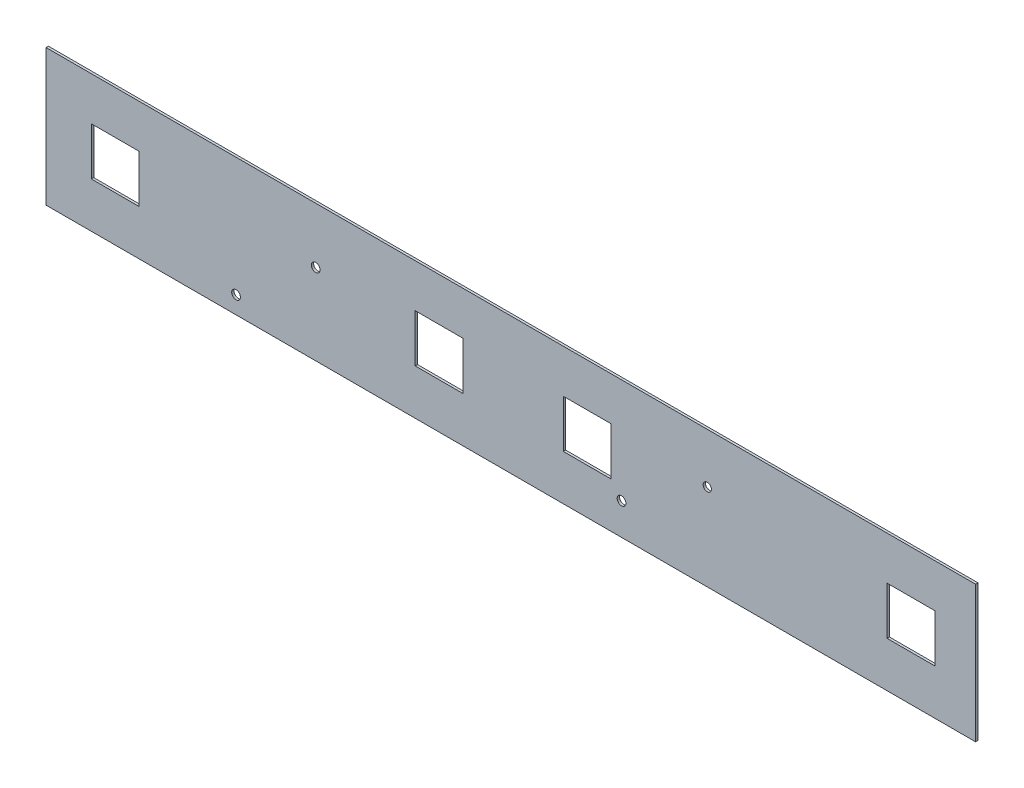
ISO-10303-21;
HEADER;
FILE_DESCRIPTION(('STEP AP214'),'2;1');
FILE_NAME('part.step','',(''),(''),'','','');
FILE_SCHEMA(('AUTOMOTIVE_DESIGN { 1 0 10303 214 1 1 1 1 }'));
ENDSEC;
DATA;
#1=APPLICATION_CONTEXT('core data for automotive mechanical design processes');
#2=APPLICATION_PROTOCOL_DEFINITION('international standard','automotive_design',2000,#1);
#3=PRODUCT_CONTEXT('',#1,'mechanical');
#4=PRODUCT('Part','Part','',(#3));
#5=PRODUCT_RELATED_PRODUCT_CATEGORY('part','',(#4));
#6=PRODUCT_DEFINITION_FORMATION('','',#4);
#7=PRODUCT_DEFINITION_CONTEXT('part definition',#1,'design');
#8=PRODUCT_DEFINITION('design','',#6,#7);
#9=PRODUCT_DEFINITION_SHAPE('','',#8);
#10=(LENGTH_UNIT() NAMED_UNIT(*) SI_UNIT(.MILLI.,.METRE.));
#11=(NAMED_UNIT(*) PLANE_ANGLE_UNIT() SI_UNIT($,.RADIAN.));
#12=(NAMED_UNIT(*) SI_UNIT($,.STERADIAN.) SOLID_ANGLE_UNIT());
#13=UNCERTAINTY_MEASURE_WITH_UNIT(LENGTH_MEASURE(1.E-05),#10,'distance_accuracy_value','');
#14=(GEOMETRIC_REPRESENTATION_CONTEXT(3) GLOBAL_UNCERTAINTY_ASSIGNED_CONTEXT((#13)) GLOBAL_UNIT_ASSIGNED_CONTEXT((#10,
#11,#12)) REPRESENTATION_CONTEXT('',''));
#15=CARTESIAN_POINT('',(0.,0.,0.));
#16=DIRECTION('',(0.,0.,1.));
#17=DIRECTION('',(1.,0.,0.));
#18=AXIS2_PLACEMENT_3D('',#15,#16,#17);
#19=CARTESIAN_POINT('',(-350.636981865229,-168.419363817683,-1.5875));
#20=DIRECTION('',(-1.,0.,0.));
#21=DIRECTION('',(0.,0.,1.));
#22=AXIS2_PLACEMENT_3D('',#19,#20,#21);
#23=PLANE('',#22);
#24=DIRECTION('',(0.,-1.,0.));
#25=VECTOR('',#24,1.);
#26=CARTESIAN_POINT('',(-350.636981865229,-168.419363817683,0.));
#27=LINE('',#26,#25);
#28=CARTESIAN_POINT('',(-350.636981865229,-76.8447438176829,0.));
#29=VERTEX_POINT('',#28);
#30=CARTESIAN_POINT('',(-350.636981865229,-168.419363817683,0.));
#31=VERTEX_POINT('',#30);
#32=EDGE_CURVE('E349',#29,#31,#27,.T.);
#33=ORIENTED_EDGE('',*,*,#32,.F.);
#34=DIRECTION('',(0.,0.,1.));
#35=VECTOR('',#34,1.);
#36=CARTESIAN_POINT('',(-350.636981865229,-76.8447438176829,-1.5875));
#37=LINE('',#36,#35);
#38=CARTESIAN_POINT('',(-350.636981865229,-76.8447438176829,-1.5875));
#39=VERTEX_POINT('',#38);
#40=EDGE_CURVE('E193',#39,#29,#37,.T.);
#41=ORIENTED_EDGE('',*,*,#40,.F.);
#42=DIRECTION('',(0.,-1.,0.));
#43=VECTOR('',#42,1.);
#44=CARTESIAN_POINT('',(-350.636981865229,-168.419363817683,-1.5875));
#45=LINE('',#44,#43);
#46=CARTESIAN_POINT('',(-350.636981865229,-168.419363817683,-1.5875));
#47=VERTEX_POINT('',#46);
#48=EDGE_CURVE('E197',#39,#47,#45,.T.);
#49=ORIENTED_EDGE('',*,*,#48,.T.);
#50=DIRECTION('',(0.,0.,1.));
#51=VECTOR('',#50,1.);
#52=CARTESIAN_POINT('',(-350.636981865229,-168.419363817683,-1.5875));
#53=LINE('',#52,#51);
#54=EDGE_CURVE('E42',#47,#31,#53,.T.);
#55=ORIENTED_EDGE('',*,*,#54,.T.);
#56=EDGE_LOOP('',(#33,#41,#49,#55));
#57=FACE_BOUND('',#56,.T.);
#58=ADVANCED_FACE('F39',(#57),#23,.T.);
#59=CARTESIAN_POINT('',(272.922858134777,-168.419363817683,-1.5875));
#60=DIRECTION('',(1.,0.,0.));
#61=DIRECTION('',(0.,0.,-1.));
#62=AXIS2_PLACEMENT_3D('',#59,#60,#61);
#63=PLANE('',#62);
#64=DIRECTION('',(0.,1.,0.));
#65=VECTOR('',#64,1.);
#66=CARTESIAN_POINT('',(272.922858134777,-168.419363817683,0.));
#67=LINE('',#66,#65);
#68=CARTESIAN_POINT('',(272.922858134777,-168.419363817683,0.));
#69=VERTEX_POINT('',#68);
#70=CARTESIAN_POINT('',(272.922858134777,-76.8447438176829,0.));
#71=VERTEX_POINT('',#70);
#72=EDGE_CURVE('E353',#69,#71,#67,.T.);
#73=ORIENTED_EDGE('',*,*,#72,.F.);
#74=DIRECTION('',(0.,0.,1.));
#75=VECTOR('',#74,1.);
#76=CARTESIAN_POINT('',(272.922858134777,-168.419363817683,-1.5875));
#77=LINE('',#76,#75);
#78=CARTESIAN_POINT('',(272.922858134777,-168.419363817683,-1.5875));
#79=VERTEX_POINT('',#78);
#80=EDGE_CURVE('E11',#79,#69,#77,.T.);
#81=ORIENTED_EDGE('',*,*,#80,.F.);
#82=DIRECTION('',(0.,1.,0.));
#83=VECTOR('',#82,1.);
#84=CARTESIAN_POINT('',(272.922858134777,-168.419363817683,-1.5875));
#85=LINE('',#84,#83);
#86=CARTESIAN_POINT('',(272.922858134777,-76.8447438176829,-1.5875));
#87=VERTEX_POINT('',#86);
#88=EDGE_CURVE('E174',#79,#87,#85,.T.);
#89=ORIENTED_EDGE('',*,*,#88,.T.);
#90=DIRECTION('',(0.,0.,1.));
#91=VECTOR('',#90,1.);
#92=CARTESIAN_POINT('',(272.922858134777,-76.8447438176829,-1.5875));
#93=LINE('',#92,#91);
#94=EDGE_CURVE('E178',#87,#71,#93,.T.);
#95=ORIENTED_EDGE('',*,*,#94,.T.);
#96=EDGE_LOOP('',(#73,#81,#89,#95));
#97=FACE_BOUND('',#96,.T.);
#98=ADVANCED_FACE('F177',(#97),#63,.T.);
#99=CARTESIAN_POINT('',(-350.636981865229,-168.419363817683,-1.5875));
#100=DIRECTION('',(0.,-1.,0.));
#101=DIRECTION('',(0.,0.,-1.));
#102=AXIS2_PLACEMENT_3D('',#99,#100,#101);
#103=PLANE('',#102);
#104=DIRECTION('',(1.,0.,0.));
#105=VECTOR('',#104,1.);
#106=CARTESIAN_POINT('',(-350.636981865229,-168.419363817683,0.));
#107=LINE('',#106,#105);
#108=EDGE_CURVE('E357',#31,#69,#107,.T.);
#109=ORIENTED_EDGE('',*,*,#108,.F.);
#110=ORIENTED_EDGE('',*,*,#54,.F.);
#111=DIRECTION('',(1.,0.,0.));
#112=VECTOR('',#111,1.);
#113=CARTESIAN_POINT('',(-350.636981865229,-168.419363817683,-1.5875));
#114=LINE('',#113,#112);
#115=EDGE_CURVE('E184',#47,#79,#114,.T.);
#116=ORIENTED_EDGE('',*,*,#115,.T.);
#117=ORIENTED_EDGE('',*,*,#80,.T.);
#118=EDGE_LOOP('',(#109,#110,#116,#117));
#119=FACE_BOUND('',#118,.T.);
#120=ADVANCED_FACE('F364',(#119),#103,.T.);
#121=CARTESIAN_POINT('',(0.,0.,-1.5875));
#122=DIRECTION('',(0.,0.,-1.));
#123=DIRECTION('',(-1.,0.,0.));
#124=AXIS2_PLACEMENT_3D('',#121,#122,#123);
#125=PLANE('',#124);
#126=CARTESIAN_POINT('',(35.3919470457483,-147.147547141894,-1.5875));
#127=DIRECTION('',(0.,0.,1.));
#128=DIRECTION('',(1.,0.,0.));
#129=AXIS2_PLACEMENT_3D('',#126,#127,#128);
#130=CIRCLE('',#129,2.921);
#131=CARTESIAN_POINT('',(38.3129470457483,-147.147547141894,-1.5875));
#132=VERTEX_POINT('',#131);
#133=EDGE_CURVE('E298',#132,#132,#130,.T.);
#134=ORIENTED_EDGE('',*,*,#133,.T.);
#135=EDGE_LOOP('',(#134));
#136=FACE_BOUND('',#135,.T.);
#137=CARTESIAN_POINT('',(-169.771284735148,-114.16527071053,-1.5875));
#138=DIRECTION('',(0.,0.,1.));
#139=DIRECTION('',(1.,0.,0.));
#140=AXIS2_PLACEMENT_3D('',#137,#138,#139);
#141=CIRCLE('',#140,2.92100000000005);
#142=CARTESIAN_POINT('',(-166.850284735148,-114.16527071053,-1.5875));
#143=VERTEX_POINT('',#142);
#144=EDGE_CURVE('E305',#143,#143,#141,.T.);
#145=ORIENTED_EDGE('',*,*,#144,.T.);
#146=EDGE_LOOP('',(#145));
#147=FACE_BOUND('',#146,.T.);
#148=CARTESIAN_POINT('',(-223.149152531126,-156.736460083098,-1.5875));
#149=DIRECTION('',(0.,0.,1.));
#150=DIRECTION('',(1.,0.,0.));
#151=AXIS2_PLACEMENT_3D('',#148,#149,#150);
#152=CIRCLE('',#151,2.921);
#153=CARTESIAN_POINT('',(-220.228152531126,-156.736460083098,-1.5875));
#154=VERTEX_POINT('',#153);
#155=EDGE_CURVE('E311',#154,#154,#152,.T.);
#156=ORIENTED_EDGE('',*,*,#155,.T.);
#157=EDGE_LOOP('',(#156));
#158=FACE_BOUND('',#157,.T.);
#159=DIRECTION('',(0.,-1.,0.));
#160=VECTOR('',#159,1.);
#161=CARTESIAN_POINT('',(-320.189901865221,-137.992427931692,-1.5875));
#162=LINE('',#161,#160);
#163=CARTESIAN_POINT('',(-320.189901865221,-105.912427931693,-1.5875));
#164=VERTEX_POINT('',#163);
#165=CARTESIAN_POINT('',(-320.189901865221,-137.992427931692,-1.5875));
#166=VERTEX_POINT('',#165);
#167=EDGE_CURVE('E318',#164,#166,#162,.T.);
#168=ORIENTED_EDGE('',*,*,#167,.T.);
#169=DIRECTION('',(1.,0.,0.));
#170=VECTOR('',#169,1.);
#171=CARTESIAN_POINT('',(-320.189901865221,-137.992427931692,-1.5875));
#172=LINE('',#171,#170);
#173=CARTESIAN_POINT('',(-288.109901865222,-137.992427931692,-1.5875));
#174=VERTEX_POINT('',#173);
#175=EDGE_CURVE('E321',#166,#174,#172,.T.);
#176=ORIENTED_EDGE('',*,*,#175,.T.);
#177=DIRECTION('',(0.,1.,0.));
#178=VECTOR('',#177,1.);
#179=CARTESIAN_POINT('',(-288.109901865222,-137.992427931692,-1.5875));
#180=LINE('',#179,#178);
#181=CARTESIAN_POINT('',(-288.109901865222,-105.912427931693,-1.5875));
#182=VERTEX_POINT('',#181);
#183=EDGE_CURVE('E53',#174,#182,#180,.T.);
#184=ORIENTED_EDGE('',*,*,#183,.T.);
#185=DIRECTION('',(-1.,0.,0.));
#186=VECTOR('',#185,1.);
#187=CARTESIAN_POINT('',(-320.189901865221,-105.912427931693,-1.5875));
#188=LINE('',#187,#186);
#189=EDGE_CURVE('E326',#182,#164,#188,.T.);
#190=ORIENTED_EDGE('',*,*,#189,.T.);
#191=EDGE_LOOP('',(#168,#176,#184,#190));
#192=FACE_BOUND('',#191,.T.);
#193=DIRECTION('',(0.,-1.,0.));
#194=VECTOR('',#193,1.);
#195=CARTESIAN_POINT('',(-102.971641865221,-137.99242793169,-1.5875));
#196=LINE('',#195,#194);
#197=CARTESIAN_POINT('',(-102.971641865221,-105.912427931692,-1.5875));
#198=VERTEX_POINT('',#197);
#199=CARTESIAN_POINT('',(-102.971641865221,-137.99242793169,-1.5875));
#200=VERTEX_POINT('',#199);
#201=EDGE_CURVE('E204',#198,#200,#196,.T.);
#202=ORIENTED_EDGE('',*,*,#201,.T.);
#203=DIRECTION('',(1.,0.,0.));
#204=VECTOR('',#203,1.);
#205=CARTESIAN_POINT('',(-102.971641865221,-137.99242793169,-1.5875));
#206=LINE('',#205,#204);
#207=CARTESIAN_POINT('',(-70.8916418652224,-137.99242793169,-1.5875));
#208=VERTEX_POINT('',#207);
#209=EDGE_CURVE('E207',#200,#208,#206,.T.);
#210=ORIENTED_EDGE('',*,*,#209,.T.);
#211=DIRECTION('',(0.,1.,0.));
#212=VECTOR('',#211,1.);
#213=CARTESIAN_POINT('',(-70.8916418652224,-137.99242793169,-1.5875));
#214=LINE('',#213,#212);
#215=CARTESIAN_POINT('',(-70.8916418652224,-105.912427931692,-1.5875));
#216=VERTEX_POINT('',#215);
#217=EDGE_CURVE('E61',#208,#216,#214,.T.);
#218=ORIENTED_EDGE('',*,*,#217,.T.);
#219=DIRECTION('',(-1.,0.,0.));
#220=VECTOR('',#219,1.);
#221=CARTESIAN_POINT('',(-102.971641865221,-105.912427931692,-1.5875));
#222=LINE('',#221,#220);
#223=EDGE_CURVE('E212',#216,#198,#222,.T.);
#224=ORIENTED_EDGE('',*,*,#223,.T.);
#225=EDGE_LOOP('',(#202,#210,#218,#224));
#226=FACE_BOUND('',#225,.T.);
#227=DIRECTION('',(0.,-1.,0.));
#228=VECTOR('',#227,1.);
#229=CARTESIAN_POINT('',(-3.64748186522514,-137.99242793169,-1.5875));
#230=LINE('',#229,#228);
#231=CARTESIAN_POINT('',(-3.64748186522514,-105.912427931693,-1.5875));
#232=VERTEX_POINT('',#231);
#233=CARTESIAN_POINT('',(-3.64748186522514,-137.99242793169,-1.5875));
#234=VERTEX_POINT('',#233);
#235=EDGE_CURVE('E236',#232,#234,#230,.T.);
#236=ORIENTED_EDGE('',*,*,#235,.T.);
#237=DIRECTION('',(1.,0.,0.));
#238=VECTOR('',#237,1.);
#239=CARTESIAN_POINT('',(-3.64748186522514,-137.99242793169,-1.5875));
#240=LINE('',#239,#238);
#241=CARTESIAN_POINT('',(28.4325181347717,-137.99242793169,-1.5875));
#242=VERTEX_POINT('',#241);
#243=EDGE_CURVE('E239',#234,#242,#240,.T.);
#244=ORIENTED_EDGE('',*,*,#243,.T.);
#245=DIRECTION('',(0.,1.,0.));
#246=VECTOR('',#245,1.);
#247=CARTESIAN_POINT('',(28.4325181347717,-137.99242793169,-1.5875));
#248=LINE('',#247,#246);
#249=CARTESIAN_POINT('',(28.4325181347717,-105.912427931693,-1.5875));
#250=VERTEX_POINT('',#249);
#251=EDGE_CURVE('E243',#242,#250,#248,.T.);
#252=ORIENTED_EDGE('',*,*,#251,.T.);
#253=DIRECTION('',(-1.,0.,0.));
#254=VECTOR('',#253,1.);
#255=CARTESIAN_POINT('',(-3.64748186522514,-105.912427931693,-1.5875));
#256=LINE('',#255,#254);
#257=EDGE_CURVE('E246',#250,#232,#256,.T.);
#258=ORIENTED_EDGE('',*,*,#257,.T.);
#259=EDGE_LOOP('',(#236,#244,#252,#258));
#260=FACE_BOUND('',#259,.T.);
#261=DIRECTION('',(0.,-1.,0.));
#262=VECTOR('',#261,1.);
#263=CARTESIAN_POINT('',(213.570778134775,-137.992427931688,-1.5875));
#264=LINE('',#263,#262);
#265=CARTESIAN_POINT('',(213.570778134775,-105.912427931693,-1.5875));
#266=VERTEX_POINT('',#265);
#267=CARTESIAN_POINT('',(213.570778134775,-137.992427931688,-1.5875));
#268=VERTEX_POINT('',#267);
#269=EDGE_CURVE('E268',#266,#268,#264,.T.);
#270=ORIENTED_EDGE('',*,*,#269,.T.);
#271=DIRECTION('',(1.,0.,0.));
#272=VECTOR('',#271,1.);
#273=CARTESIAN_POINT('',(213.570778134775,-137.992427931688,-1.5875));
#274=LINE('',#273,#272);
#275=CARTESIAN_POINT('',(245.65077813477,-137.992427931688,-1.5875));
#276=VERTEX_POINT('',#275);
#277=EDGE_CURVE('E271',#268,#276,#274,.T.);
#278=ORIENTED_EDGE('',*,*,#277,.T.);
#279=DIRECTION('',(0.,1.,0.));
#280=VECTOR('',#279,1.);
#281=CARTESIAN_POINT('',(245.65077813477,-137.992427931688,-1.5875));
#282=LINE('',#281,#280);
#283=CARTESIAN_POINT('',(245.65077813477,-105.912427931693,-1.5875));
#284=VERTEX_POINT('',#283);
#285=EDGE_CURVE('E275',#276,#284,#282,.T.);
#286=ORIENTED_EDGE('',*,*,#285,.T.);
#287=DIRECTION('',(-1.,0.,0.));
#288=VECTOR('',#287,1.);
#289=CARTESIAN_POINT('',(213.570778134775,-105.912427931693,-1.5875));
#290=LINE('',#289,#288);
#291=EDGE_CURVE('E278',#284,#266,#290,.T.);
#292=ORIENTED_EDGE('',*,*,#291,.T.);
#293=EDGE_LOOP('',(#270,#278,#286,#292));
#294=FACE_BOUND('',#293,.T.);
#295=CARTESIAN_POINT('',(92.9145155292168,-110.36906090191,-1.5875));
#296=DIRECTION('',(0.,0.,1.));
#297=DIRECTION('',(1.,0.,0.));
#298=AXIS2_PLACEMENT_3D('',#295,#296,#297);
#299=CIRCLE('',#298,2.75000000000002);
#300=CARTESIAN_POINT('',(95.6645155292168,-110.36906090191,-1.5875));
#301=VERTEX_POINT('',#300);
#302=EDGE_CURVE('E346',#301,#301,#299,.T.);
#303=ORIENTED_EDGE('',*,*,#302,.T.);
#304=EDGE_LOOP('',(#303));
#305=FACE_BOUND('',#304,.T.);
#306=ORIENTED_EDGE('',*,*,#48,.F.);
#307=DIRECTION('',(-1.,0.,0.));
#308=VECTOR('',#307,1.);
#309=CARTESIAN_POINT('',(-350.636981865229,-76.8447438176829,-1.5875));
#310=LINE('',#309,#308);
#311=EDGE_CURVE('E190',#87,#39,#310,.T.);
#312=ORIENTED_EDGE('',*,*,#311,.F.);
#313=ORIENTED_EDGE('',*,*,#88,.F.);
#314=ORIENTED_EDGE('',*,*,#115,.F.);
#315=EDGE_LOOP('',(#306,#312,#313,#314));
#316=FACE_BOUND('',#315,.T.);
#317=ADVANCED_FACE('F195',(#136,#147,#158,#192,#226,#260,#294,#305,#316),#125,.T.);
#318=CARTESIAN_POINT('',(0.,0.,0.));
#319=DIRECTION('',(0.,0.,-1.));
#320=DIRECTION('',(-1.,0.,0.));
#321=AXIS2_PLACEMENT_3D('',#318,#319,#320);
#322=PLANE('',#321);
#323=CARTESIAN_POINT('',(35.3919470457483,-147.147547141894,0.));
#324=DIRECTION('',(0.,0.,1.));
#325=DIRECTION('',(1.,0.,0.));
#326=AXIS2_PLACEMENT_3D('',#323,#324,#325);
#327=CIRCLE('',#326,2.921);
#328=CARTESIAN_POINT('',(38.3129470457483,-147.147547141894,0.));
#329=VERTEX_POINT('',#328);
#330=EDGE_CURVE('E302',#329,#329,#327,.T.);
#331=ORIENTED_EDGE('',*,*,#330,.F.);
#332=EDGE_LOOP('',(#331));
#333=FACE_BOUND('',#332,.T.);
#334=CARTESIAN_POINT('',(-169.771284735148,-114.16527071053,0.));
#335=DIRECTION('',(0.,0.,1.));
#336=DIRECTION('',(1.,0.,0.));
#337=AXIS2_PLACEMENT_3D('',#334,#335,#336);
#338=CIRCLE('',#337,2.92100000000005);
#339=CARTESIAN_POINT('',(-166.850284735148,-114.16527071053,0.));
#340=VERTEX_POINT('',#339);
#341=EDGE_CURVE('E308',#340,#340,#338,.T.);
#342=ORIENTED_EDGE('',*,*,#341,.F.);
#343=EDGE_LOOP('',(#342));
#344=FACE_BOUND('',#343,.T.);
#345=CARTESIAN_POINT('',(-223.149152531126,-156.736460083098,0.));
#346=DIRECTION('',(0.,0.,1.));
#347=DIRECTION('',(1.,0.,0.));
#348=AXIS2_PLACEMENT_3D('',#345,#346,#347);
#349=CIRCLE('',#348,2.921);
#350=CARTESIAN_POINT('',(-220.228152531126,-156.736460083098,0.));
#351=VERTEX_POINT('',#350);
#352=EDGE_CURVE('E314',#351,#351,#349,.T.);
#353=ORIENTED_EDGE('',*,*,#352,.F.);
#354=EDGE_LOOP('',(#353));
#355=FACE_BOUND('',#354,.T.);
#356=DIRECTION('',(1.,0.,0.));
#357=VECTOR('',#356,1.);
#358=CARTESIAN_POINT('',(-320.189901865221,-137.992427931692,0.));
#359=LINE('',#358,#357);
#360=CARTESIAN_POINT('',(-320.189901865221,-137.992427931692,0.));
#361=VERTEX_POINT('',#360);
#362=CARTESIAN_POINT('',(-288.109901865222,-137.992427931692,0.));
#363=VERTEX_POINT('',#362);
#364=EDGE_CURVE('E331',#361,#363,#359,.T.);
#365=ORIENTED_EDGE('',*,*,#364,.F.);
#366=DIRECTION('',(0.,-1.,0.));
#367=VECTOR('',#366,1.);
#368=CARTESIAN_POINT('',(-320.189901865221,-137.992427931692,0.));
#369=LINE('',#368,#367);
#370=CARTESIAN_POINT('',(-320.189901865221,-105.912427931693,0.));
#371=VERTEX_POINT('',#370);
#372=EDGE_CURVE('E229',#371,#361,#369,.T.);
#373=ORIENTED_EDGE('',*,*,#372,.F.);
#374=DIRECTION('',(-1.,0.,0.));
#375=VECTOR('',#374,1.);
#376=CARTESIAN_POINT('',(-320.189901865221,-105.912427931693,0.));
#377=LINE('',#376,#375);
#378=CARTESIAN_POINT('',(-288.109901865222,-105.912427931693,0.));
#379=VERTEX_POINT('',#378);
#380=EDGE_CURVE('E322',#379,#371,#377,.T.);
#381=ORIENTED_EDGE('',*,*,#380,.F.);
#382=DIRECTION('',(0.,1.,0.));
#383=VECTOR('',#382,1.);
#384=CARTESIAN_POINT('',(-288.109901865222,-137.992427931692,0.));
#385=LINE('',#384,#383);
#386=EDGE_CURVE('E334',#363,#379,#385,.T.);
#387=ORIENTED_EDGE('',*,*,#386,.F.);
#388=EDGE_LOOP('',(#365,#373,#381,#387));
#389=FACE_BOUND('',#388,.T.);
#390=DIRECTION('',(1.,0.,0.));
#391=VECTOR('',#390,1.);
#392=CARTESIAN_POINT('',(-102.971641865221,-137.99242793169,0.));
#393=LINE('',#392,#391);
#394=CARTESIAN_POINT('',(-102.971641865221,-137.99242793169,0.));
#395=VERTEX_POINT('',#394);
#396=CARTESIAN_POINT('',(-70.8916418652224,-137.99242793169,0.));
#397=VERTEX_POINT('',#396);
#398=EDGE_CURVE('E218',#395,#397,#393,.T.);
#399=ORIENTED_EDGE('',*,*,#398,.F.);
#400=DIRECTION('',(0.,-1.,0.));
#401=VECTOR('',#400,1.);
#402=CARTESIAN_POINT('',(-102.971641865221,-137.99242793169,0.));
#403=LINE('',#402,#401);
#404=CARTESIAN_POINT('',(-102.971641865221,-105.912427931692,0.));
#405=VERTEX_POINT('',#404);
#406=EDGE_CURVE('E216',#405,#395,#403,.T.);
#407=ORIENTED_EDGE('',*,*,#406,.F.);
#408=DIRECTION('',(-1.,0.,0.));
#409=VECTOR('',#408,1.);
#410=CARTESIAN_POINT('',(-102.971641865221,-105.912427931692,0.));
#411=LINE('',#410,#409);
#412=CARTESIAN_POINT('',(-70.8916418652224,-105.912427931692,0.));
#413=VERTEX_POINT('',#412);
#414=EDGE_CURVE('E208',#413,#405,#411,.T.);
#415=ORIENTED_EDGE('',*,*,#414,.F.);
#416=DIRECTION('',(0.,1.,0.));
#417=VECTOR('',#416,1.);
#418=CARTESIAN_POINT('',(-70.8916418652224,-137.99242793169,0.));
#419=LINE('',#418,#417);
#420=EDGE_CURVE('E222',#397,#413,#419,.T.);
#421=ORIENTED_EDGE('',*,*,#420,.F.);
#422=EDGE_LOOP('',(#399,#407,#415,#421));
#423=FACE_BOUND('',#422,.T.);
#424=DIRECTION('',(1.,0.,0.));
#425=VECTOR('',#424,1.);
#426=CARTESIAN_POINT('',(-3.64748186522514,-137.99242793169,0.));
#427=LINE('',#426,#425);
#428=CARTESIAN_POINT('',(-3.64748186522514,-137.99242793169,0.));
#429=VERTEX_POINT('',#428);
#430=CARTESIAN_POINT('',(28.4325181347717,-137.99242793169,0.));
#431=VERTEX_POINT('',#430);
#432=EDGE_CURVE('E252',#429,#431,#427,.T.);
#433=ORIENTED_EDGE('',*,*,#432,.F.);
#434=DIRECTION('',(0.,-1.,0.));
#435=VECTOR('',#434,1.);
#436=CARTESIAN_POINT('',(-3.64748186522514,-137.99242793169,0.));
#437=LINE('',#436,#435);
#438=CARTESIAN_POINT('',(-3.64748186522514,-105.912427931693,0.));
#439=VERTEX_POINT('',#438);
#440=EDGE_CURVE('E250',#439,#429,#437,.T.);
#441=ORIENTED_EDGE('',*,*,#440,.F.);
#442=DIRECTION('',(-1.,0.,0.));
#443=VECTOR('',#442,1.);
#444=CARTESIAN_POINT('',(-3.64748186522514,-105.912427931693,0.));
#445=LINE('',#444,#443);
#446=CARTESIAN_POINT('',(28.4325181347717,-105.912427931693,0.));
#447=VERTEX_POINT('',#446);
#448=EDGE_CURVE('E240',#447,#439,#445,.T.);
#449=ORIENTED_EDGE('',*,*,#448,.F.);
#450=DIRECTION('',(0.,1.,0.));
#451=VECTOR('',#450,1.);
#452=CARTESIAN_POINT('',(28.4325181347717,-137.99242793169,0.));
#453=LINE('',#452,#451);
#454=EDGE_CURVE('E256',#431,#447,#453,.T.);
#455=ORIENTED_EDGE('',*,*,#454,.F.);
#456=EDGE_LOOP('',(#433,#441,#449,#455));
#457=FACE_BOUND('',#456,.T.);
#458=DIRECTION('',(1.,0.,0.));
#459=VECTOR('',#458,1.);
#460=CARTESIAN_POINT('',(213.570778134775,-137.992427931688,0.));
#461=LINE('',#460,#459);
#462=CARTESIAN_POINT('',(213.570778134775,-137.992427931688,0.));
#463=VERTEX_POINT('',#462);
#464=CARTESIAN_POINT('',(245.65077813477,-137.992427931688,0.));
#465=VERTEX_POINT('',#464);
#466=EDGE_CURVE('E283',#463,#465,#461,.T.);
#467=ORIENTED_EDGE('',*,*,#466,.F.);
#468=DIRECTION('',(0.,-1.,0.));
#469=VECTOR('',#468,1.);
#470=CARTESIAN_POINT('',(213.570778134775,-137.992427931688,0.));
#471=LINE('',#470,#469);
#472=CARTESIAN_POINT('',(213.570778134775,-105.912427931693,0.));
#473=VERTEX_POINT('',#472);
#474=EDGE_CURVE('E202',#473,#463,#471,.T.);
#475=ORIENTED_EDGE('',*,*,#474,.F.);
#476=DIRECTION('',(-1.,0.,0.));
#477=VECTOR('',#476,1.);
#478=CARTESIAN_POINT('',(213.570778134775,-105.912427931693,0.));
#479=LINE('',#478,#477);
#480=CARTESIAN_POINT('',(245.65077813477,-105.912427931693,0.));
#481=VERTEX_POINT('',#480);
#482=EDGE_CURVE('E272',#481,#473,#479,.T.);
#483=ORIENTED_EDGE('',*,*,#482,.F.);
#484=DIRECTION('',(0.,1.,0.));
#485=VECTOR('',#484,1.);
#486=CARTESIAN_POINT('',(245.65077813477,-137.992427931688,0.));
#487=LINE('',#486,#485);
#488=EDGE_CURVE('E286',#465,#481,#487,.T.);
#489=ORIENTED_EDGE('',*,*,#488,.F.);
#490=EDGE_LOOP('',(#467,#475,#483,#489));
#491=FACE_BOUND('',#490,.T.);
#492=CARTESIAN_POINT('',(92.9145155292168,-110.36906090191,0.));
#493=DIRECTION('',(0.,0.,1.));
#494=DIRECTION('',(1.,0.,0.));
#495=AXIS2_PLACEMENT_3D('',#492,#493,#494);
#496=CIRCLE('',#495,2.75000000000002);
#497=CARTESIAN_POINT('',(95.6645155292168,-110.36906090191,0.));
#498=VERTEX_POINT('',#497);
#499=EDGE_CURVE('E301',#498,#498,#496,.T.);
#500=ORIENTED_EDGE('',*,*,#499,.F.);
#501=EDGE_LOOP('',(#500));
#502=FACE_BOUND('',#501,.T.);
#503=ORIENTED_EDGE('',*,*,#32,.T.);
#504=ORIENTED_EDGE('',*,*,#108,.T.);
#505=ORIENTED_EDGE('',*,*,#72,.T.);
#506=DIRECTION('',(-1.,0.,0.));
#507=VECTOR('',#506,1.);
#508=CARTESIAN_POINT('',(-350.636981865229,-76.8447438176829,0.));
#509=LINE('',#508,#507);
#510=EDGE_CURVE('E192',#71,#29,#509,.T.);
#511=ORIENTED_EDGE('',*,*,#510,.T.);
#512=EDGE_LOOP('',(#503,#504,#505,#511));
#513=FACE_BOUND('',#512,.T.);
#514=ADVANCED_FACE('F361',(#333,#344,#355,#389,#423,#457,#491,#502,#513),#322,.F.);
#515=CARTESIAN_POINT('',(92.9145155292168,-110.36906090191,-1.5875));
#516=DIRECTION('',(0.,0.,1.));
#517=DIRECTION('',(1.,0.,0.));
#518=AXIS2_PLACEMENT_3D('',#515,#516,#517);
#519=CYLINDRICAL_SURFACE('',#518,2.75000000000002);
#520=ORIENTED_EDGE('',*,*,#302,.F.);
#521=EDGE_LOOP('',(#520));
#522=FACE_BOUND('',#521,.T.);
#523=ORIENTED_EDGE('',*,*,#499,.T.);
#524=EDGE_LOOP('',(#523));
#525=FACE_BOUND('',#524,.T.);
#526=ADVANCED_FACE('F377',(#522,#525),#519,.F.);
#527=CARTESIAN_POINT('',(213.570778134775,-137.992427931688,-1.5875));
#528=DIRECTION('',(-1.,0.,0.));
#529=DIRECTION('',(0.,0.,1.));
#530=AXIS2_PLACEMENT_3D('',#527,#528,#529);
#531=PLANE('',#530);
#532=ORIENTED_EDGE('',*,*,#474,.T.);
#533=DIRECTION('',(0.,0.,1.));
#534=VECTOR('',#533,1.);
#535=CARTESIAN_POINT('',(213.570778134775,-137.992427931688,-1.5875));
#536=LINE('',#535,#534);
#537=EDGE_CURVE('E281',#268,#463,#536,.T.);
#538=ORIENTED_EDGE('',*,*,#537,.F.);
#539=ORIENTED_EDGE('',*,*,#269,.F.);
#540=DIRECTION('',(0.,0.,1.));
#541=VECTOR('',#540,1.);
#542=CARTESIAN_POINT('',(213.570778134775,-105.912427931693,-1.5875));
#543=LINE('',#542,#541);
#544=EDGE_CURVE('E253',#266,#473,#543,.T.);
#545=ORIENTED_EDGE('',*,*,#544,.T.);
#546=EDGE_LOOP('',(#532,#538,#539,#545));
#547=FACE_BOUND('',#546,.T.);
#548=ADVANCED_FACE('F384',(#547),#531,.F.);
#549=CARTESIAN_POINT('',(213.570778134775,-105.912427931693,-1.5875));
#550=DIRECTION('',(0.,1.,0.));
#551=DIRECTION('',(0.,0.,1.));
#552=AXIS2_PLACEMENT_3D('',#549,#550,#551);
#553=PLANE('',#552);
#554=ORIENTED_EDGE('',*,*,#482,.T.);
#555=ORIENTED_EDGE('',*,*,#544,.F.);
#556=ORIENTED_EDGE('',*,*,#291,.F.);
#557=DIRECTION('',(0.,0.,1.));
#558=VECTOR('',#557,1.);
#559=CARTESIAN_POINT('',(245.65077813477,-105.912427931693,-1.5875));
#560=LINE('',#559,#558);
#561=EDGE_CURVE('E292',#284,#481,#560,.T.);
#562=ORIENTED_EDGE('',*,*,#561,.T.);
#563=EDGE_LOOP('',(#554,#555,#556,#562));
#564=FACE_BOUND('',#563,.T.);
#565=ADVANCED_FACE('F416',(#564),#553,.F.);
#566=CARTESIAN_POINT('',(245.65077813477,-137.992427931688,-1.5875));
#567=DIRECTION('',(1.,0.,0.));
#568=DIRECTION('',(0.,0.,-1.));
#569=AXIS2_PLACEMENT_3D('',#566,#567,#568);
#570=PLANE('',#569);
#571=ORIENTED_EDGE('',*,*,#488,.T.);
#572=ORIENTED_EDGE('',*,*,#561,.F.);
#573=ORIENTED_EDGE('',*,*,#285,.F.);
#574=DIRECTION('',(0.,0.,1.));
#575=VECTOR('',#574,1.);
#576=CARTESIAN_POINT('',(245.65077813477,-137.992427931688,-1.5875));
#577=LINE('',#576,#575);
#578=EDGE_CURVE('E294',#276,#465,#577,.T.);
#579=ORIENTED_EDGE('',*,*,#578,.T.);
#580=EDGE_LOOP('',(#571,#572,#573,#579));
#581=FACE_BOUND('',#580,.T.);
#582=ADVANCED_FACE('F422',(#581),#570,.F.);
#583=CARTESIAN_POINT('',(213.570778134775,-137.992427931688,-1.5875));
#584=DIRECTION('',(0.,-1.,0.));
#585=DIRECTION('',(0.,0.,-1.));
#586=AXIS2_PLACEMENT_3D('',#583,#584,#585);
#587=PLANE('',#586);
#588=ORIENTED_EDGE('',*,*,#466,.T.);
#589=ORIENTED_EDGE('',*,*,#578,.F.);
#590=ORIENTED_EDGE('',*,*,#277,.F.);
#591=ORIENTED_EDGE('',*,*,#537,.T.);
#592=EDGE_LOOP('',(#588,#589,#590,#591));
#593=FACE_BOUND('',#592,.T.);
#594=ADVANCED_FACE('F418',(#593),#587,.F.);
#595=CARTESIAN_POINT('',(-3.64748186522514,-137.99242793169,-1.5875));
#596=DIRECTION('',(-1.,0.,0.));
#597=DIRECTION('',(0.,0.,1.));
#598=AXIS2_PLACEMENT_3D('',#595,#596,#597);
#599=PLANE('',#598);
#600=ORIENTED_EDGE('',*,*,#440,.T.);
#601=DIRECTION('',(0.,0.,1.));
#602=VECTOR('',#601,1.);
#603=CARTESIAN_POINT('',(-3.64748186522514,-137.99242793169,-1.5875));
#604=LINE('',#603,#602);
#605=EDGE_CURVE('E249',#234,#429,#604,.T.);
#606=ORIENTED_EDGE('',*,*,#605,.F.);
#607=ORIENTED_EDGE('',*,*,#235,.F.);
#608=DIRECTION('',(0.,0.,1.));
#609=VECTOR('',#608,1.);
#610=CARTESIAN_POINT('',(-3.64748186522514,-105.912427931693,-1.5875));
#611=LINE('',#610,#609);
#612=EDGE_CURVE('E219',#232,#439,#611,.T.);
#613=ORIENTED_EDGE('',*,*,#612,.T.);
#614=EDGE_LOOP('',(#600,#606,#607,#613));
#615=FACE_BOUND('',#614,.T.);
#616=ADVANCED_FACE('F421',(#615),#599,.F.);
#617=CARTESIAN_POINT('',(-3.64748186522514,-105.912427931693,-1.5875));
#618=DIRECTION('',(0.,1.,0.));
#619=DIRECTION('',(0.,0.,1.));
#620=AXIS2_PLACEMENT_3D('',#617,#618,#619);
#621=PLANE('',#620);
#622=ORIENTED_EDGE('',*,*,#448,.T.);
#623=ORIENTED_EDGE('',*,*,#612,.F.);
#624=ORIENTED_EDGE('',*,*,#257,.F.);
#625=DIRECTION('',(0.,0.,1.));
#626=VECTOR('',#625,1.);
#627=CARTESIAN_POINT('',(28.4325181347717,-105.912427931693,-1.5875));
#628=LINE('',#627,#626);
#629=EDGE_CURVE('E262',#250,#447,#628,.T.);
#630=ORIENTED_EDGE('',*,*,#629,.T.);
#631=EDGE_LOOP('',(#622,#623,#624,#630));
#632=FACE_BOUND('',#631,.T.);
#633=ADVANCED_FACE('F432',(#632),#621,.F.);
#634=CARTESIAN_POINT('',(28.4325181347717,-137.99242793169,-1.5875));
#635=DIRECTION('',(1.,0.,0.));
#636=DIRECTION('',(0.,0.,-1.));
#637=AXIS2_PLACEMENT_3D('',#634,#635,#636);
#638=PLANE('',#637);
#639=ORIENTED_EDGE('',*,*,#454,.T.);
#640=ORIENTED_EDGE('',*,*,#629,.F.);
#641=ORIENTED_EDGE('',*,*,#251,.F.);
#642=DIRECTION('',(0.,0.,1.));
#643=VECTOR('',#642,1.);
#644=CARTESIAN_POINT('',(28.4325181347717,-137.99242793169,-1.5875));
#645=LINE('',#644,#643);
#646=EDGE_CURVE('E264',#242,#431,#645,.T.);
#647=ORIENTED_EDGE('',*,*,#646,.T.);
#648=EDGE_LOOP('',(#639,#640,#641,#647));
#649=FACE_BOUND('',#648,.T.);
#650=ADVANCED_FACE('F438',(#649),#638,.F.);
#651=CARTESIAN_POINT('',(-3.64748186522514,-137.99242793169,-1.5875));
#652=DIRECTION('',(0.,-1.,0.));
#653=DIRECTION('',(0.,0.,-1.));
#654=AXIS2_PLACEMENT_3D('',#651,#652,#653);
#655=PLANE('',#654);
#656=ORIENTED_EDGE('',*,*,#432,.T.);
#657=ORIENTED_EDGE('',*,*,#646,.F.);
#658=ORIENTED_EDGE('',*,*,#243,.F.);
#659=ORIENTED_EDGE('',*,*,#605,.T.);
#660=EDGE_LOOP('',(#656,#657,#658,#659));
#661=FACE_BOUND('',#660,.T.);
#662=ADVANCED_FACE('F434',(#661),#655,.F.);
#663=CARTESIAN_POINT('',(-102.971641865221,-137.99242793169,-1.5875));
#664=DIRECTION('',(-1.,0.,0.));
#665=DIRECTION('',(0.,0.,1.));
#666=AXIS2_PLACEMENT_3D('',#663,#664,#665);
#667=PLANE('',#666);
#668=ORIENTED_EDGE('',*,*,#406,.T.);
#669=DIRECTION('',(0.,0.,1.));
#670=VECTOR('',#669,1.);
#671=CARTESIAN_POINT('',(-102.971641865221,-137.99242793169,-1.5875));
#672=LINE('',#671,#670);
#673=EDGE_CURVE('E215',#200,#395,#672,.T.);
#674=ORIENTED_EDGE('',*,*,#673,.F.);
#675=ORIENTED_EDGE('',*,*,#201,.F.);
#676=DIRECTION('',(0.,0.,1.));
#677=VECTOR('',#676,1.);
#678=CARTESIAN_POINT('',(-102.971641865221,-105.912427931692,-1.5875));
#679=LINE('',#678,#677);
#680=EDGE_CURVE('E227',#198,#405,#679,.T.);
#681=ORIENTED_EDGE('',*,*,#680,.T.);
#682=EDGE_LOOP('',(#668,#674,#675,#681));
#683=FACE_BOUND('',#682,.T.);
#684=ADVANCED_FACE('F437',(#683),#667,.F.);
#685=CARTESIAN_POINT('',(-102.971641865221,-105.912427931692,-1.5875));
#686=DIRECTION('',(0.,1.,0.));
#687=DIRECTION('',(0.,0.,1.));
#688=AXIS2_PLACEMENT_3D('',#685,#686,#687);
#689=PLANE('',#688);
#690=ORIENTED_EDGE('',*,*,#414,.T.);
#691=ORIENTED_EDGE('',*,*,#680,.F.);
#692=ORIENTED_EDGE('',*,*,#223,.F.);
#693=DIRECTION('',(0.,0.,1.));
#694=VECTOR('',#693,1.);
#695=CARTESIAN_POINT('',(-70.8916418652224,-105.912427931692,-1.5875));
#696=LINE('',#695,#694);
#697=EDGE_CURVE('E230',#216,#413,#696,.T.);
#698=ORIENTED_EDGE('',*,*,#697,.T.);
#699=EDGE_LOOP('',(#690,#691,#692,#698));
#700=FACE_BOUND('',#699,.T.);
#701=ADVANCED_FACE('F448',(#700),#689,.F.);
#702=CARTESIAN_POINT('',(-70.8916418652224,-137.99242793169,-1.5875));
#703=DIRECTION('',(1.,0.,0.));
#704=DIRECTION('',(0.,0.,-1.));
#705=AXIS2_PLACEMENT_3D('',#702,#703,#704);
#706=PLANE('',#705);
#707=ORIENTED_EDGE('',*,*,#420,.T.);
#708=ORIENTED_EDGE('',*,*,#697,.F.);
#709=ORIENTED_EDGE('',*,*,#217,.F.);
#710=DIRECTION('',(0.,0.,1.));
#711=VECTOR('',#710,1.);
#712=CARTESIAN_POINT('',(-70.8916418652224,-137.99242793169,-1.5875));
#713=LINE('',#712,#711);
#714=EDGE_CURVE('E232',#208,#397,#713,.T.);
#715=ORIENTED_EDGE('',*,*,#714,.T.);
#716=EDGE_LOOP('',(#707,#708,#709,#715));
#717=FACE_BOUND('',#716,.T.);
#718=ADVANCED_FACE('F452',(#717),#706,.F.);
#719=CARTESIAN_POINT('',(-102.971641865221,-137.99242793169,-1.5875));
#720=DIRECTION('',(0.,-1.,0.));
#721=DIRECTION('',(0.,0.,-1.));
#722=AXIS2_PLACEMENT_3D('',#719,#720,#721);
#723=PLANE('',#722);
#724=ORIENTED_EDGE('',*,*,#398,.T.);
#725=ORIENTED_EDGE('',*,*,#714,.F.);
#726=ORIENTED_EDGE('',*,*,#209,.F.);
#727=ORIENTED_EDGE('',*,*,#673,.T.);
#728=EDGE_LOOP('',(#724,#725,#726,#727));
#729=FACE_BOUND('',#728,.T.);
#730=ADVANCED_FACE('F390',(#729),#723,.F.);
#731=CARTESIAN_POINT('',(-320.189901865221,-137.992427931692,-1.5875));
#732=DIRECTION('',(-1.,0.,0.));
#733=DIRECTION('',(0.,0.,1.));
#734=AXIS2_PLACEMENT_3D('',#731,#732,#733);
#735=PLANE('',#734);
#736=ORIENTED_EDGE('',*,*,#372,.T.);
#737=DIRECTION('',(0.,0.,1.));
#738=VECTOR('',#737,1.);
#739=CARTESIAN_POINT('',(-320.189901865221,-137.992427931692,-1.5875));
#740=LINE('',#739,#738);
#741=EDGE_CURVE('E329',#166,#361,#740,.T.);
#742=ORIENTED_EDGE('',*,*,#741,.F.);
#743=ORIENTED_EDGE('',*,*,#167,.F.);
#744=DIRECTION('',(0.,0.,1.));
#745=VECTOR('',#744,1.);
#746=CARTESIAN_POINT('',(-320.189901865221,-105.912427931693,-1.5875));
#747=LINE('',#746,#745);
#748=EDGE_CURVE('E317',#164,#371,#747,.T.);
#749=ORIENTED_EDGE('',*,*,#748,.T.);
#750=EDGE_LOOP('',(#736,#742,#743,#749));
#751=FACE_BOUND('',#750,.T.);
#752=ADVANCED_FACE('F386',(#751),#735,.F.);
#753=CARTESIAN_POINT('',(-320.189901865221,-105.912427931693,-1.5875));
#754=DIRECTION('',(0.,1.,0.));
#755=DIRECTION('',(0.,0.,1.));
#756=AXIS2_PLACEMENT_3D('',#753,#754,#755);
#757=PLANE('',#756);
#758=ORIENTED_EDGE('',*,*,#380,.T.);
#759=ORIENTED_EDGE('',*,*,#748,.F.);
#760=ORIENTED_EDGE('',*,*,#189,.F.);
#761=DIRECTION('',(0.,0.,1.));
#762=VECTOR('',#761,1.);
#763=CARTESIAN_POINT('',(-288.109901865222,-105.912427931693,-1.5875));
#764=LINE('',#763,#762);
#765=EDGE_CURVE('E340',#182,#379,#764,.T.);
#766=ORIENTED_EDGE('',*,*,#765,.T.);
#767=EDGE_LOOP('',(#758,#759,#760,#766));
#768=FACE_BOUND('',#767,.T.);
#769=ADVANCED_FACE('F389',(#768),#757,.F.);
#770=CARTESIAN_POINT('',(-288.109901865222,-137.992427931692,-1.5875));
#771=DIRECTION('',(1.,0.,0.));
#772=DIRECTION('',(0.,0.,-1.));
#773=AXIS2_PLACEMENT_3D('',#770,#771,#772);
#774=PLANE('',#773);
#775=ORIENTED_EDGE('',*,*,#386,.T.);
#776=ORIENTED_EDGE('',*,*,#765,.F.);
#777=ORIENTED_EDGE('',*,*,#183,.F.);
#778=DIRECTION('',(0.,0.,1.));
#779=VECTOR('',#778,1.);
#780=CARTESIAN_POINT('',(-288.109901865222,-137.992427931692,-1.5875));
#781=LINE('',#780,#779);
#782=EDGE_CURVE('E342',#174,#363,#781,.T.);
#783=ORIENTED_EDGE('',*,*,#782,.T.);
#784=EDGE_LOOP('',(#775,#776,#777,#783));
#785=FACE_BOUND('',#784,.T.);
#786=ADVANCED_FACE('F396',(#785),#774,.F.);
#787=CARTESIAN_POINT('',(-320.189901865221,-137.992427931692,-1.5875));
#788=DIRECTION('',(0.,-1.,0.));
#789=DIRECTION('',(0.,0.,-1.));
#790=AXIS2_PLACEMENT_3D('',#787,#788,#789);
#791=PLANE('',#790);
#792=ORIENTED_EDGE('',*,*,#364,.T.);
#793=ORIENTED_EDGE('',*,*,#782,.F.);
#794=ORIENTED_EDGE('',*,*,#175,.F.);
#795=ORIENTED_EDGE('',*,*,#741,.T.);
#796=EDGE_LOOP('',(#792,#793,#794,#795));
#797=FACE_BOUND('',#796,.T.);
#798=ADVANCED_FACE('F392',(#797),#791,.F.);
#799=CARTESIAN_POINT('',(-223.149152531126,-156.736460083098,-1.5875));
#800=DIRECTION('',(0.,0.,1.));
#801=DIRECTION('',(1.,0.,0.));
#802=AXIS2_PLACEMENT_3D('',#799,#800,#801);
#803=CYLINDRICAL_SURFACE('',#802,2.921);
#804=ORIENTED_EDGE('',*,*,#155,.F.);
#805=EDGE_LOOP('',(#804));
#806=FACE_BOUND('',#805,.T.);
#807=ORIENTED_EDGE('',*,*,#352,.T.);
#808=EDGE_LOOP('',(#807));
#809=FACE_BOUND('',#808,.T.);
#810=ADVANCED_FACE('F395',(#806,#809),#803,.F.);
#811=CARTESIAN_POINT('',(-169.771284735148,-114.16527071053,-1.5875));
#812=DIRECTION('',(0.,0.,1.));
#813=DIRECTION('',(1.,0.,0.));
#814=AXIS2_PLACEMENT_3D('',#811,#812,#813);
#815=CYLINDRICAL_SURFACE('',#814,2.92100000000005);
#816=ORIENTED_EDGE('',*,*,#144,.F.);
#817=EDGE_LOOP('',(#816));
#818=FACE_BOUND('',#817,.T.);
#819=ORIENTED_EDGE('',*,*,#341,.T.);
#820=EDGE_LOOP('',(#819));
#821=FACE_BOUND('',#820,.T.);
#822=ADVANCED_FACE('F405',(#818,#821),#815,.F.);
#823=CARTESIAN_POINT('',(35.3919470457483,-147.147547141894,-1.5875));
#824=DIRECTION('',(0.,0.,1.));
#825=DIRECTION('',(1.,0.,0.));
#826=AXIS2_PLACEMENT_3D('',#823,#824,#825);
#827=CYLINDRICAL_SURFACE('',#826,2.921);
#828=ORIENTED_EDGE('',*,*,#133,.F.);
#829=EDGE_LOOP('',(#828));
#830=FACE_BOUND('',#829,.T.);
#831=ORIENTED_EDGE('',*,*,#330,.T.);
#832=EDGE_LOOP('',(#831));
#833=FACE_BOUND('',#832,.T.);
#834=ADVANCED_FACE('F409',(#830,#833),#827,.F.);
#835=CARTESIAN_POINT('',(-350.636981865229,-76.8447438176829,-1.5875));
#836=DIRECTION('',(0.,1.,0.));
#837=DIRECTION('',(0.,0.,1.));
#838=AXIS2_PLACEMENT_3D('',#835,#836,#837);
#839=PLANE('',#838);
#840=ORIENTED_EDGE('',*,*,#510,.F.);
#841=ORIENTED_EDGE('',*,*,#94,.F.);
#842=ORIENTED_EDGE('',*,*,#311,.T.);
#843=ORIENTED_EDGE('',*,*,#40,.T.);
#844=EDGE_LOOP('',(#840,#841,#842,#843));
#845=FACE_BOUND('',#844,.T.);
#846=ADVANCED_FACE('F188',(#845),#839,.T.);
#847=CLOSED_SHELL('',(#58,#98,#120,#317,#514,#526,#548,#565,#582,#594,#616,#633,#650,#662,#684,
#701,#718,#730,#752,#769,#786,#798,#810,#822,#834,#846));
#848=MANIFOLD_SOLID_BREP('B2',#847);
#849=ADVANCED_BREP_SHAPE_REPRESENTATION('',(#18,#848),#14);
#850=SHAPE_DEFINITION_REPRESENTATION(#9,#849);
ENDSEC;
END-ISO-10303-21;
